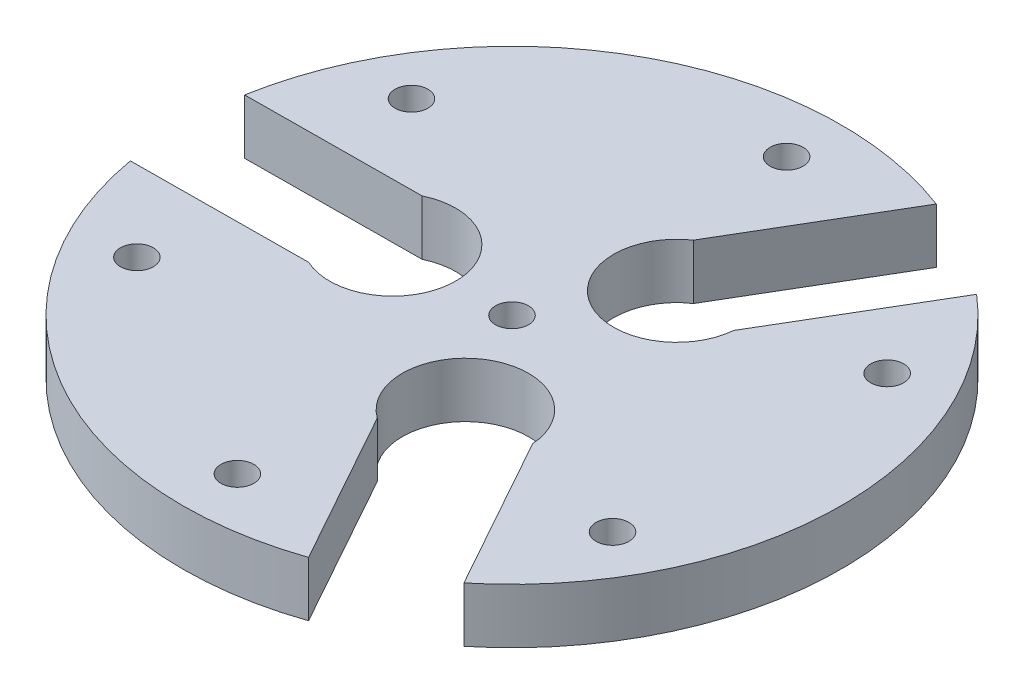
ISO-10303-21;
HEADER;
FILE_DESCRIPTION(('STEP AP214'),'2;1');
FILE_NAME('part.step','',(''),(''),'','','');
FILE_SCHEMA(('AUTOMOTIVE_DESIGN { 1 0 10303 214 1 1 1 1 }'));
ENDSEC;
DATA;
#1=APPLICATION_CONTEXT('core data for automotive mechanical design processes');
#2=APPLICATION_PROTOCOL_DEFINITION('international standard','automotive_design',2000,#1);
#3=PRODUCT_CONTEXT('',#1,'mechanical');
#4=PRODUCT('Part','Part','',(#3));
#5=PRODUCT_RELATED_PRODUCT_CATEGORY('part','',(#4));
#6=PRODUCT_DEFINITION_FORMATION('','',#4);
#7=PRODUCT_DEFINITION_CONTEXT('part definition',#1,'design');
#8=PRODUCT_DEFINITION('design','',#6,#7);
#9=PRODUCT_DEFINITION_SHAPE('','',#8);
#10=(LENGTH_UNIT() NAMED_UNIT(*) SI_UNIT(.MILLI.,.METRE.));
#11=(NAMED_UNIT(*) PLANE_ANGLE_UNIT() SI_UNIT($,.RADIAN.));
#12=(NAMED_UNIT(*) SI_UNIT($,.STERADIAN.) SOLID_ANGLE_UNIT());
#13=UNCERTAINTY_MEASURE_WITH_UNIT(LENGTH_MEASURE(1.E-05),#10,'distance_accuracy_value','');
#14=(GEOMETRIC_REPRESENTATION_CONTEXT(3) GLOBAL_UNCERTAINTY_ASSIGNED_CONTEXT((#13)) GLOBAL_UNIT_ASSIGNED_CONTEXT((#10,
#11,#12)) REPRESENTATION_CONTEXT('',''));
#15=CARTESIAN_POINT('',(0.,0.,0.));
#16=DIRECTION('',(0.,0.,1.));
#17=DIRECTION('',(1.,0.,0.));
#18=AXIS2_PLACEMENT_3D('',#15,#16,#17);
#19=CARTESIAN_POINT('',(0.,5.,0.));
#20=DIRECTION('',(0.,-1.,0.));
#21=DIRECTION('',(0.,0.,-1.));
#22=AXIS2_PLACEMENT_3D('',#19,#20,#21);
#23=CYLINDRICAL_SURFACE('',#22,30.);
#24=CARTESIAN_POINT('',(0.,5.,0.));
#25=DIRECTION('',(0.,1.,0.));
#26=DIRECTION('',(0.,0.,1.));
#27=AXIS2_PLACEMENT_3D('',#24,#25,#26);
#28=CIRCLE('',#27,30.);
#29=CARTESIAN_POINT('',(-29.5464548136969,5.,5.19682671850488));
#30=VERTEX_POINT('',#29);
#31=CARTESIAN_POINT('',(9.82540013085804,5.,28.34539666804));
#32=VERTEX_POINT('',#31);
#33=EDGE_CURVE('E164',#30,#32,#28,.T.);
#34=ORIENTED_EDGE('',*,*,#33,.F.);
#35=DIRECTION('',(0.,-1.,0.));
#36=VECTOR('',#35,1.);
#37=CARTESIAN_POINT('',(-29.5464548136969,5.,5.19682671850488));
#38=LINE('',#37,#36);
#39=CARTESIAN_POINT('',(-29.5464548136969,0.,5.19682671850488));
#40=VERTEX_POINT('',#39);
#41=EDGE_CURVE('E267',#30,#40,#38,.T.);
#42=ORIENTED_EDGE('',*,*,#41,.T.);
#43=CARTESIAN_POINT('',(0.,0.,0.));
#44=DIRECTION('',(0.,1.,0.));
#45=DIRECTION('',(0.,0.,1.));
#46=AXIS2_PLACEMENT_3D('',#43,#44,#45);
#47=CIRCLE('',#46,30.);
#48=CARTESIAN_POINT('',(9.82540013085803,0.,28.34539666804));
#49=VERTEX_POINT('',#48);
#50=EDGE_CURVE('E168',#40,#49,#47,.T.);
#51=ORIENTED_EDGE('',*,*,#50,.T.);
#52=DIRECTION('',(0.,-1.,0.));
#53=VECTOR('',#52,1.);
#54=CARTESIAN_POINT('',(9.82540013085803,5.,28.34539666804));
#55=LINE('',#54,#53);
#56=EDGE_CURVE('E268',#49,#32,#55,.F.);
#57=ORIENTED_EDGE('',*,*,#56,.T.);
#58=EDGE_LOOP('',(#34,#42,#51,#57));
#59=FACE_BOUND('',#58,.T.);
#60=ADVANCED_FACE('F36',(#59),#23,.T.);
#61=CARTESIAN_POINT('',(10.5363716890121,0.,-28.088874516986));
#62=VERTEX_POINT('',#61);
#63=CARTESIAN_POINT('',(-29.5452875017292,0.,-5.203459084125));
#64=VERTEX_POINT('',#63);
#65=EDGE_CURVE('E171',#62,#64,#47,.T.);
#66=ORIENTED_EDGE('',*,*,#65,.T.);
#67=DIRECTION('',(0.,-1.,0.));
#68=VECTOR('',#67,1.);
#69=CARTESIAN_POINT('',(-29.5452875017292,5.,-5.203459084125));
#70=LINE('',#69,#68);
#71=CARTESIAN_POINT('',(-29.5452875017292,5.,-5.203459084125));
#72=VERTEX_POINT('',#71);
#73=EDGE_CURVE('E282',#64,#72,#70,.F.);
#74=ORIENTED_EDGE('',*,*,#73,.T.);
#75=CARTESIAN_POINT('',(10.5363716890121,5.,-28.088874516986));
#76=VERTEX_POINT('',#75);
#77=EDGE_CURVE('E145',#76,#72,#28,.T.);
#78=ORIENTED_EDGE('',*,*,#77,.F.);
#79=DIRECTION('',(0.,-1.,0.));
#80=VECTOR('',#79,1.);
#81=CARTESIAN_POINT('',(10.5363716890121,5.,-28.088874516986));
#82=LINE('',#81,#80);
#83=EDGE_CURVE('E220',#76,#62,#82,.T.);
#84=ORIENTED_EDGE('',*,*,#83,.T.);
#85=EDGE_LOOP('',(#66,#74,#78,#84));
#86=FACE_BOUND('',#85,.T.);
#87=ADVANCED_FACE('F255',(#86),#23,.T.);
#88=CARTESIAN_POINT('',(18.9126667814305,0.,23.2875725487775));
#89=VERTEX_POINT('',#88);
#90=CARTESIAN_POINT('',(19.4933352486007,0.,-22.8037251537038));
#91=VERTEX_POINT('',#90);
#92=EDGE_CURVE('E167',#89,#91,#47,.T.);
#93=ORIENTED_EDGE('',*,*,#92,.T.);
#94=DIRECTION('',(0.,-1.,0.));
#95=VECTOR('',#94,1.);
#96=CARTESIAN_POINT('',(19.4933352486007,5.,-22.8037251537038));
#97=LINE('',#96,#95);
#98=CARTESIAN_POINT('',(19.4933352486007,5.,-22.8037251537038));
#99=VERTEX_POINT('',#98);
#100=EDGE_CURVE('E221',#91,#99,#97,.F.);
#101=ORIENTED_EDGE('',*,*,#100,.T.);
#102=CARTESIAN_POINT('',(18.9126667814305,5.,23.2875725487775));
#103=VERTEX_POINT('',#102);
#104=EDGE_CURVE('E135',#103,#99,#28,.T.);
#105=ORIENTED_EDGE('',*,*,#104,.F.);
#106=DIRECTION('',(0.,-1.,0.));
#107=VECTOR('',#106,1.);
#108=CARTESIAN_POINT('',(18.9126667814305,5.,23.2875725487775));
#109=LINE('',#108,#107);
#110=EDGE_CURVE('E295',#103,#89,#109,.T.);
#111=ORIENTED_EDGE('',*,*,#110,.T.);
#112=EDGE_LOOP('',(#93,#101,#105,#111));
#113=FACE_BOUND('',#112,.T.);
#114=ADVANCED_FACE('F38',(#113),#23,.T.);
#115=CARTESIAN_POINT('',(0.,5.,0.));
#116=DIRECTION('',(0.,1.,0.));
#117=DIRECTION('',(0.,0.,1.));
#118=AXIS2_PLACEMENT_3D('',#115,#116,#117);
#119=PLANE('',#118);
#120=DIRECTION('',(0.999973339309519,0.,-0.00730210039432319));
#121=VECTOR('',#120,1.);
#122=CARTESIAN_POINT('',(-10.9702272881856,5.,5.06117762366727));
#123=LINE('',#122,#121);
#124=CARTESIAN_POINT('',(-13.4242400991269,5.,5.07909754933931));
#125=VERTEX_POINT('',#124);
#126=EDGE_CURVE('E146',#30,#125,#123,.T.);
#127=ORIENTED_EDGE('',*,*,#126,.F.);
#128=ORIENTED_EDGE('',*,*,#33,.T.);
#129=DIRECTION('',(0.486329242236781,0.,0.87377563947812));
#130=VECTOR('',#129,1.);
#131=CARTESIAN_POINT('',(0.781671877206522,5.,12.0967553119167));
#132=LINE('',#131,#130);
#133=CARTESIAN_POINT('',(1.9751618872587,5.,14.2410690939704));
#134=VERTEX_POINT('',#133);
#135=EDGE_CURVE('E271',#134,#32,#132,.T.);
#136=ORIENTED_EDGE('',*,*,#135,.F.);
#137=CARTESIAN_POINT('',(5.32530520249275,5.,9.56784325228541));
#138=DIRECTION('',(0.,1.,0.));
#139=DIRECTION('',(0.,0.,1.));
#140=AXIS2_PLACEMENT_3D('',#137,#138,#139);
#141=CIRCLE('',#140,5.75);
#142=CARTESIAN_POINT('',(11.0624285378312,5.,9.18324497470791));
#143=VERTEX_POINT('',#142);
#144=EDGE_CURVE('E150',#143,#134,#141,.T.);
#145=ORIENTED_EDGE('',*,*,#144,.F.);
#146=DIRECTION('',(-0.486329242236781,0.,-0.87377563947812));
#147=VECTOR('',#146,1.);
#148=CARTESIAN_POINT('',(9.86893852777898,5.,7.03893119265415));
#149=LINE('',#148,#147);
#150=EDGE_CURVE('E279',#103,#143,#149,.T.);
#151=ORIENTED_EDGE('',*,*,#150,.F.);
#152=ORIENTED_EDGE('',*,*,#104,.T.);
#153=DIRECTION('',(0.508187438777136,0.,-0.861246496114286));
#154=VECTOR('',#153,1.);
#155=CARTESIAN_POINT('',(10.0431342344039,5.,-6.78807445081033));
#156=LINE('',#155,#154);
#157=CARTESIAN_POINT('',(11.2902659689156,5.,-8.90164073478959));
#158=VERTEX_POINT('',#157);
#159=EDGE_CURVE('E273',#158,#99,#156,.T.);
#160=ORIENTED_EDGE('',*,*,#159,.F.);
#161=CARTESIAN_POINT('',(5.56465245460964,5.,-9.43064913245143));
#162=DIRECTION('',(0.,1.,0.));
#163=DIRECTION('',(0.,0.,1.));
#164=AXIS2_PLACEMENT_3D('',#161,#162,#163);
#165=CIRCLE('',#164,5.75000000000001);
#166=CARTESIAN_POINT('',(2.33330240932705,5.,-14.1867900980718));
#167=VERTEX_POINT('',#166);
#168=EDGE_CURVE('E154',#167,#158,#165,.T.);
#169=ORIENTED_EDGE('',*,*,#168,.F.);
#170=DIRECTION('',(-0.508187438777136,0.,0.861246496114286));
#171=VECTOR('',#170,1.);
#172=CARTESIAN_POINT('',(1.08617067481535,5.,-12.0732238140925));
#173=LINE('',#172,#171);
#174=EDGE_CURVE('E59',#76,#167,#173,.T.);
#175=ORIENTED_EDGE('',*,*,#174,.F.);
#176=ORIENTED_EDGE('',*,*,#77,.T.);
#177=DIRECTION('',(-0.999973339309519,0.,0.00730210039432328));
#178=VECTOR('',#177,1.);
#179=CARTESIAN_POINT('',(-11.0461691322866,5.,-5.33854510515174));
#180=LINE('',#179,#178);
#181=CARTESIAN_POINT('',(-13.5001819432279,5.,-5.3206251794797));
#182=VERTEX_POINT('',#181);
#183=EDGE_CURVE('E126',#182,#72,#180,.T.);
#184=ORIENTED_EDGE('',*,*,#183,.F.);
#185=CARTESIAN_POINT('',(-11.0081982102361,5.,-0.13868374074223));
#186=DIRECTION('',(0.,1.,0.));
#187=DIRECTION('',(0.,0.,1.));
#188=AXIS2_PLACEMENT_3D('',#185,#186,#187);
#189=CIRCLE('',#188,5.75);
#190=EDGE_CURVE('E143',#125,#182,#189,.T.);
#191=ORIENTED_EDGE('',*,*,#190,.F.);
#192=EDGE_LOOP('',(#127,#128,#136,#145,#151,#152,#160,#169,#175,#176,#184,#191));
#193=FACE_BOUND('',#192,.T.);
#194=CARTESIAN_POINT('',(21.6506350946108,5.,-12.5000000000003));
#195=DIRECTION('',(0.,1.,0.));
#196=DIRECTION('',(-0.866025403784433,0.,0.50000000000001));
#197=AXIS2_PLACEMENT_3D('',#194,#195,#196);
#198=CIRCLE('',#197,1.5);
#199=CARTESIAN_POINT('',(20.3515969889342,5.,-11.7500000000002));
#200=VERTEX_POINT('',#199);
#201=EDGE_CURVE('E223',#200,#200,#198,.T.);
#202=ORIENTED_EDGE('',*,*,#201,.F.);
#203=EDGE_LOOP('',(#202));
#204=FACE_BOUND('',#203,.T.);
#205=CARTESIAN_POINT('',(21.6506350946111,5.,12.4999999999998));
#206=DIRECTION('',(0.,1.,0.));
#207=DIRECTION('',(-0.866025403784443,0.,-0.499999999999992));
#208=AXIS2_PLACEMENT_3D('',#205,#206,#207);
#209=CIRCLE('',#208,1.5);
#210=CARTESIAN_POINT('',(20.3515969889344,5.,11.7499999999998));
#211=VERTEX_POINT('',#210);
#212=EDGE_CURVE('E235',#211,#211,#209,.T.);
#213=ORIENTED_EDGE('',*,*,#212,.F.);
#214=EDGE_LOOP('',(#213));
#215=FACE_BOUND('',#214,.T.);
#216=CARTESIAN_POINT('',(0.,5.,25.));
#217=DIRECTION('',(0.,1.,0.));
#218=DIRECTION('',(0.,0.,-1.));
#219=AXIS2_PLACEMENT_3D('',#216,#217,#218);
#220=CIRCLE('',#219,1.5);
#221=CARTESIAN_POINT('',(0.,5.,23.5));
#222=VERTEX_POINT('',#221);
#223=EDGE_CURVE('E232',#222,#222,#220,.T.);
#224=ORIENTED_EDGE('',*,*,#223,.F.);
#225=EDGE_LOOP('',(#224));
#226=FACE_BOUND('',#225,.T.);
#227=CARTESIAN_POINT('',(-21.6506350946109,5.,12.5000000000001));
#228=DIRECTION('',(0.,1.,0.));
#229=DIRECTION('',(0.866025403784436,0.,-0.500000000000004));
#230=AXIS2_PLACEMENT_3D('',#227,#228,#229);
#231=CIRCLE('',#230,1.5);
#232=CARTESIAN_POINT('',(-20.3515969889343,5.,11.7500000000001));
#233=VERTEX_POINT('',#232);
#234=EDGE_CURVE('E229',#233,#233,#231,.T.);
#235=ORIENTED_EDGE('',*,*,#234,.F.);
#236=EDGE_LOOP('',(#235));
#237=FACE_BOUND('',#236,.T.);
#238=CARTESIAN_POINT('',(-21.650635094611,5.,-12.5));
#239=DIRECTION('',(0.,1.,0.));
#240=DIRECTION('',(0.86602540378444,0.,0.499999999999998));
#241=AXIS2_PLACEMENT_3D('',#238,#239,#240);
#242=CIRCLE('',#241,1.5);
#243=CARTESIAN_POINT('',(-20.3515969889343,5.,-11.75));
#244=VERTEX_POINT('',#243);
#245=EDGE_CURVE('E187',#244,#244,#242,.T.);
#246=ORIENTED_EDGE('',*,*,#245,.F.);
#247=EDGE_LOOP('',(#246));
#248=FACE_BOUND('',#247,.T.);
#249=CARTESIAN_POINT('',(0.,5.,-25.));
#250=DIRECTION('',(0.,1.,0.));
#251=DIRECTION('',(0.,0.,1.));
#252=AXIS2_PLACEMENT_3D('',#249,#250,#251);
#253=CIRCLE('',#252,1.5);
#254=CARTESIAN_POINT('',(0.,5.,-23.5));
#255=VERTEX_POINT('',#254);
#256=EDGE_CURVE('E182',#255,#255,#253,.T.);
#257=ORIENTED_EDGE('',*,*,#256,.F.);
#258=EDGE_LOOP('',(#257));
#259=FACE_BOUND('',#258,.T.);
#260=CARTESIAN_POINT('',(0.,5.,0.));
#261=DIRECTION('',(0.,1.,0.));
#262=DIRECTION('',(0.,0.,1.));
#263=AXIS2_PLACEMENT_3D('',#260,#261,#262);
#264=CIRCLE('',#263,1.5);
#265=CARTESIAN_POINT('',(0.,5.,1.5));
#266=VERTEX_POINT('',#265);
#267=EDGE_CURVE('E157',#266,#266,#264,.T.);
#268=ORIENTED_EDGE('',*,*,#267,.F.);
#269=EDGE_LOOP('',(#268));
#270=FACE_BOUND('',#269,.T.);
#271=ADVANCED_FACE('F141',(#193,#204,#215,#226,#237,#248,#259,#270),#119,.T.);
#272=CARTESIAN_POINT('',(0.,0.,0.));
#273=DIRECTION('',(0.,1.,0.));
#274=DIRECTION('',(0.,0.,1.));
#275=AXIS2_PLACEMENT_3D('',#272,#273,#274);
#276=PLANE('',#275);
#277=CARTESIAN_POINT('',(21.6506350946108,0.,-12.5000000000003));
#278=DIRECTION('',(0.,1.,0.));
#279=DIRECTION('',(0.,0.,1.));
#280=AXIS2_PLACEMENT_3D('',#277,#278,#279);
#281=CIRCLE('',#280,1.5);
#282=CARTESIAN_POINT('',(21.6506350946108,0.,-11.0000000000003));
#283=VERTEX_POINT('',#282);
#284=EDGE_CURVE('E196',#283,#283,#281,.T.);
#285=ORIENTED_EDGE('',*,*,#284,.T.);
#286=EDGE_LOOP('',(#285));
#287=FACE_BOUND('',#286,.T.);
#288=CARTESIAN_POINT('',(21.6506350946111,0.,12.4999999999998));
#289=DIRECTION('',(0.,1.,0.));
#290=DIRECTION('',(0.,0.,1.));
#291=AXIS2_PLACEMENT_3D('',#288,#289,#290);
#292=CIRCLE('',#291,1.5);
#293=CARTESIAN_POINT('',(21.6506350946111,0.,13.9999999999998));
#294=VERTEX_POINT('',#293);
#295=EDGE_CURVE('E193',#294,#294,#292,.T.);
#296=ORIENTED_EDGE('',*,*,#295,.T.);
#297=EDGE_LOOP('',(#296));
#298=FACE_BOUND('',#297,.T.);
#299=CARTESIAN_POINT('',(0.,0.,25.));
#300=DIRECTION('',(0.,1.,0.));
#301=DIRECTION('',(0.,0.,1.));
#302=AXIS2_PLACEMENT_3D('',#299,#300,#301);
#303=CIRCLE('',#302,1.5);
#304=CARTESIAN_POINT('',(0.,0.,26.5));
#305=VERTEX_POINT('',#304);
#306=EDGE_CURVE('E190',#305,#305,#303,.T.);
#307=ORIENTED_EDGE('',*,*,#306,.T.);
#308=EDGE_LOOP('',(#307));
#309=FACE_BOUND('',#308,.T.);
#310=CARTESIAN_POINT('',(-21.6506350946109,0.,12.5000000000001));
#311=DIRECTION('',(0.,1.,0.));
#312=DIRECTION('',(0.,0.,1.));
#313=AXIS2_PLACEMENT_3D('',#310,#311,#312);
#314=CIRCLE('',#313,1.5);
#315=CARTESIAN_POINT('',(-21.6506350946109,0.,14.0000000000001));
#316=VERTEX_POINT('',#315);
#317=EDGE_CURVE('E186',#316,#316,#314,.T.);
#318=ORIENTED_EDGE('',*,*,#317,.T.);
#319=EDGE_LOOP('',(#318));
#320=FACE_BOUND('',#319,.T.);
#321=CARTESIAN_POINT('',(-21.650635094611,0.,-12.5));
#322=DIRECTION('',(0.,1.,0.));
#323=DIRECTION('',(0.,0.,1.));
#324=AXIS2_PLACEMENT_3D('',#321,#322,#323);
#325=CIRCLE('',#324,1.5);
#326=CARTESIAN_POINT('',(-21.650635094611,0.,-10.9999999999999));
#327=VERTEX_POINT('',#326);
#328=EDGE_CURVE('E183',#327,#327,#325,.T.);
#329=ORIENTED_EDGE('',*,*,#328,.T.);
#330=EDGE_LOOP('',(#329));
#331=FACE_BOUND('',#330,.T.);
#332=CARTESIAN_POINT('',(0.,0.,-25.));
#333=DIRECTION('',(0.,1.,0.));
#334=DIRECTION('',(0.,0.,1.));
#335=AXIS2_PLACEMENT_3D('',#332,#333,#334);
#336=CIRCLE('',#335,1.5);
#337=CARTESIAN_POINT('',(0.,0.,-23.5));
#338=VERTEX_POINT('',#337);
#339=EDGE_CURVE('E179',#338,#338,#336,.T.);
#340=ORIENTED_EDGE('',*,*,#339,.T.);
#341=EDGE_LOOP('',(#340));
#342=FACE_BOUND('',#341,.T.);
#343=CARTESIAN_POINT('',(0.,0.,0.));
#344=DIRECTION('',(0.,1.,0.));
#345=DIRECTION('',(0.,0.,1.));
#346=AXIS2_PLACEMENT_3D('',#343,#344,#345);
#347=CIRCLE('',#346,1.5);
#348=CARTESIAN_POINT('',(0.,0.,1.5));
#349=VERTEX_POINT('',#348);
#350=EDGE_CURVE('E151',#349,#349,#347,.T.);
#351=ORIENTED_EDGE('',*,*,#350,.T.);
#352=EDGE_LOOP('',(#351));
#353=FACE_BOUND('',#352,.T.);
#354=ORIENTED_EDGE('',*,*,#50,.F.);
#355=DIRECTION('',(0.99997333930952,0.,-0.0073021003943232));
#356=VECTOR('',#355,1.);
#357=CARTESIAN_POINT('',(0.0363713019454174,0.,4.98080419295096));
#358=LINE('',#357,#356);
#359=CARTESIAN_POINT('',(-13.4242400991269,0.,5.07909754933931));
#360=VERTEX_POINT('',#359);
#361=EDGE_CURVE('E284',#40,#360,#358,.T.);
#362=ORIENTED_EDGE('',*,*,#361,.T.);
#363=CARTESIAN_POINT('',(-11.0081982102361,0.,-0.13868374074223));
#364=DIRECTION('',(0.,1.,0.));
#365=DIRECTION('',(0.,0.,1.));
#366=AXIS2_PLACEMENT_3D('',#363,#364,#365);
#367=CIRCLE('',#366,5.75);
#368=CARTESIAN_POINT('',(-13.5001819432279,0.,-5.3206251794797));
#369=VERTEX_POINT('',#368);
#370=EDGE_CURVE('E172',#360,#369,#367,.T.);
#371=ORIENTED_EDGE('',*,*,#370,.T.);
#372=DIRECTION('',(-0.99997333930952,0.,0.00730210039432329));
#373=VECTOR('',#372,1.);
#374=CARTESIAN_POINT('',(-0.0395705421555444,0.,-5.41891853586805));
#375=LINE('',#374,#373);
#376=EDGE_CURVE('E129',#369,#64,#375,.T.);
#377=ORIENTED_EDGE('',*,*,#376,.T.);
#378=ORIENTED_EDGE('',*,*,#65,.F.);
#379=DIRECTION('',(-0.508187438777136,0.,0.861246496114286));
#380=VECTOR('',#379,1.);
#381=CARTESIAN_POINT('',(-4.47848177979429,0.,-2.64257468164111));
#382=LINE('',#381,#380);
#383=CARTESIAN_POINT('',(2.33330240932705,0.,-14.1867900980718));
#384=VERTEX_POINT('',#383);
#385=EDGE_CURVE('E217',#62,#384,#382,.T.);
#386=ORIENTED_EDGE('',*,*,#385,.T.);
#387=CARTESIAN_POINT('',(5.56465245460964,0.,-9.43064913245143));
#388=DIRECTION('',(0.,1.,0.));
#389=DIRECTION('',(0.,0.,1.));
#390=AXIS2_PLACEMENT_3D('',#387,#388,#389);
#391=CIRCLE('',#390,5.75000000000001);
#392=CARTESIAN_POINT('',(11.2902659689156,0.,-8.90164073478959));
#393=VERTEX_POINT('',#392);
#394=EDGE_CURVE('E163',#384,#393,#391,.T.);
#395=ORIENTED_EDGE('',*,*,#394,.T.);
#396=DIRECTION('',(0.508187438777136,0.,-0.861246496114286));
#397=VECTOR('',#396,1.);
#398=CARTESIAN_POINT('',(4.47848177979429,0.,2.64257468164111));
#399=LINE('',#398,#397);
#400=EDGE_CURVE('E51',#393,#91,#399,.T.);
#401=ORIENTED_EDGE('',*,*,#400,.T.);
#402=ORIENTED_EDGE('',*,*,#92,.F.);
#403=DIRECTION('',(-0.486329242236781,0.,-0.873775639478121));
#404=VECTOR('',#403,1.);
#405=CARTESIAN_POINT('',(4.54363332528623,0.,-2.52891205963126));
#406=LINE('',#405,#404);
#407=CARTESIAN_POINT('',(11.0624285378312,0.,9.18324497470791));
#408=VERTEX_POINT('',#407);
#409=EDGE_CURVE('E292',#89,#408,#406,.T.);
#410=ORIENTED_EDGE('',*,*,#409,.T.);
#411=CARTESIAN_POINT('',(5.32530520249275,0.,9.56784325228541));
#412=DIRECTION('',(0.,1.,0.));
#413=DIRECTION('',(0.,0.,1.));
#414=AXIS2_PLACEMENT_3D('',#411,#412,#413);
#415=CIRCLE('',#414,5.75);
#416=CARTESIAN_POINT('',(1.9751618872587,0.,14.2410690939704));
#417=VERTEX_POINT('',#416);
#418=EDGE_CURVE('E175',#408,#417,#415,.T.);
#419=ORIENTED_EDGE('',*,*,#418,.T.);
#420=DIRECTION('',(0.486329242236781,0.,0.873775639478121));
#421=VECTOR('',#420,1.);
#422=CARTESIAN_POINT('',(-4.54363332528623,0.,2.52891205963126));
#423=LINE('',#422,#421);
#424=EDGE_CURVE('E288',#417,#49,#423,.T.);
#425=ORIENTED_EDGE('',*,*,#424,.T.);
#426=EDGE_LOOP('',(#354,#362,#371,#377,#378,#386,#395,#401,#402,#410,#419,#425));
#427=FACE_BOUND('',#426,.T.);
#428=ADVANCED_FACE('F213',(#287,#298,#309,#320,#331,#342,#353,#427),#276,.F.);
#429=CARTESIAN_POINT('',(5.56465245460964,-45.,-9.43064913245143));
#430=DIRECTION('',(0.,1.,0.));
#431=DIRECTION('',(0.,0.,1.));
#432=AXIS2_PLACEMENT_3D('',#429,#430,#431);
#433=CYLINDRICAL_SURFACE('',#432,5.75000000000001);
#434=ORIENTED_EDGE('',*,*,#394,.F.);
#435=DIRECTION('',(0.,1.,0.));
#436=VECTOR('',#435,1.);
#437=CARTESIAN_POINT('',(2.33330240932705,-45.,-14.1867900980718));
#438=LINE('',#437,#436);
#439=EDGE_CURVE('E11',#384,#167,#438,.T.);
#440=ORIENTED_EDGE('',*,*,#439,.T.);
#441=ORIENTED_EDGE('',*,*,#168,.T.);
#442=DIRECTION('',(0.,1.,0.));
#443=VECTOR('',#442,1.);
#444=CARTESIAN_POINT('',(11.2902659689156,-45.,-8.90164073478959));
#445=LINE('',#444,#443);
#446=EDGE_CURVE('E44',#158,#393,#445,.F.);
#447=ORIENTED_EDGE('',*,*,#446,.T.);
#448=EDGE_LOOP('',(#434,#440,#441,#447));
#449=FACE_BOUND('',#448,.T.);
#450=ADVANCED_FACE('F207',(#449),#433,.F.);
#451=CARTESIAN_POINT('',(5.32530520249275,-45.,9.56784325228541));
#452=DIRECTION('',(0.,1.,0.));
#453=DIRECTION('',(0.,0.,1.));
#454=AXIS2_PLACEMENT_3D('',#451,#452,#453);
#455=CYLINDRICAL_SURFACE('',#454,5.75);
#456=ORIENTED_EDGE('',*,*,#418,.F.);
#457=DIRECTION('',(0.,1.,0.));
#458=VECTOR('',#457,1.);
#459=CARTESIAN_POINT('',(11.0624285378312,-45.,9.18324497470791));
#460=LINE('',#459,#458);
#461=EDGE_CURVE('E203',#408,#143,#460,.T.);
#462=ORIENTED_EDGE('',*,*,#461,.T.);
#463=ORIENTED_EDGE('',*,*,#144,.T.);
#464=DIRECTION('',(0.,1.,0.));
#465=VECTOR('',#464,1.);
#466=CARTESIAN_POINT('',(1.9751618872587,-45.,14.2410690939704));
#467=LINE('',#466,#465);
#468=EDGE_CURVE('E200',#134,#417,#467,.F.);
#469=ORIENTED_EDGE('',*,*,#468,.T.);
#470=EDGE_LOOP('',(#456,#462,#463,#469));
#471=FACE_BOUND('',#470,.T.);
#472=ADVANCED_FACE('F350',(#471),#455,.F.);
#473=CARTESIAN_POINT('',(-11.0081982102361,-45.,-0.13868374074223));
#474=DIRECTION('',(0.,1.,0.));
#475=DIRECTION('',(0.,0.,1.));
#476=AXIS2_PLACEMENT_3D('',#473,#474,#475);
#477=CYLINDRICAL_SURFACE('',#476,5.75);
#478=ORIENTED_EDGE('',*,*,#370,.F.);
#479=DIRECTION('',(0.,1.,0.));
#480=VECTOR('',#479,1.);
#481=CARTESIAN_POINT('',(-13.4242400991269,-45.,5.07909754933931));
#482=LINE('',#481,#480);
#483=EDGE_CURVE('E134',#360,#125,#482,.T.);
#484=ORIENTED_EDGE('',*,*,#483,.T.);
#485=ORIENTED_EDGE('',*,*,#190,.T.);
#486=DIRECTION('',(0.,1.,0.));
#487=VECTOR('',#486,1.);
#488=CARTESIAN_POINT('',(-13.5001819432279,-45.,-5.3206251794797));
#489=LINE('',#488,#487);
#490=EDGE_CURVE('E123',#182,#369,#489,.F.);
#491=ORIENTED_EDGE('',*,*,#490,.T.);
#492=EDGE_LOOP('',(#478,#484,#485,#491));
#493=FACE_BOUND('',#492,.T.);
#494=ADVANCED_FACE('F149',(#493),#477,.F.);
#495=CARTESIAN_POINT('',(0.,0.,0.));
#496=DIRECTION('',(0.,1.,0.));
#497=DIRECTION('',(0.,0.,1.));
#498=AXIS2_PLACEMENT_3D('',#495,#496,#497);
#499=CYLINDRICAL_SURFACE('',#498,1.5);
#500=ORIENTED_EDGE('',*,*,#350,.F.);
#501=EDGE_LOOP('',(#500));
#502=FACE_BOUND('',#501,.T.);
#503=ORIENTED_EDGE('',*,*,#267,.T.);
#504=EDGE_LOOP('',(#503));
#505=FACE_BOUND('',#504,.T.);
#506=ADVANCED_FACE('F246',(#502,#505),#499,.F.);
#507=CARTESIAN_POINT('',(0.,-5.,-25.));
#508=DIRECTION('',(0.,1.,0.));
#509=DIRECTION('',(0.,0.,1.));
#510=AXIS2_PLACEMENT_3D('',#507,#508,#509);
#511=CYLINDRICAL_SURFACE('',#510,1.5);
#512=ORIENTED_EDGE('',*,*,#256,.T.);
#513=EDGE_LOOP('',(#512));
#514=FACE_BOUND('',#513,.T.);
#515=ORIENTED_EDGE('',*,*,#339,.F.);
#516=EDGE_LOOP('',(#515));
#517=FACE_BOUND('',#516,.T.);
#518=ADVANCED_FACE('F342',(#514,#517),#511,.F.);
#519=CARTESIAN_POINT('',(-21.650635094611,-5.,-12.5));
#520=DIRECTION('',(0.,1.,0.));
#521=DIRECTION('',(0.,0.,1.));
#522=AXIS2_PLACEMENT_3D('',#519,#520,#521);
#523=CYLINDRICAL_SURFACE('',#522,1.5);
#524=ORIENTED_EDGE('',*,*,#245,.T.);
#525=EDGE_LOOP('',(#524));
#526=FACE_BOUND('',#525,.T.);
#527=ORIENTED_EDGE('',*,*,#328,.F.);
#528=EDGE_LOOP('',(#527));
#529=FACE_BOUND('',#528,.T.);
#530=ADVANCED_FACE('F328',(#526,#529),#523,.F.);
#531=CARTESIAN_POINT('',(-21.6506350946109,-5.,12.5000000000001));
#532=DIRECTION('',(0.,1.,0.));
#533=DIRECTION('',(0.,0.,1.));
#534=AXIS2_PLACEMENT_3D('',#531,#532,#533);
#535=CYLINDRICAL_SURFACE('',#534,1.5);
#536=ORIENTED_EDGE('',*,*,#234,.T.);
#537=EDGE_LOOP('',(#536));
#538=FACE_BOUND('',#537,.T.);
#539=ORIENTED_EDGE('',*,*,#317,.F.);
#540=EDGE_LOOP('',(#539));
#541=FACE_BOUND('',#540,.T.);
#542=ADVANCED_FACE('F324',(#538,#541),#535,.F.);
#543=CARTESIAN_POINT('',(0.,-5.,25.));
#544=DIRECTION('',(0.,1.,0.));
#545=DIRECTION('',(0.,0.,1.));
#546=AXIS2_PLACEMENT_3D('',#543,#544,#545);
#547=CYLINDRICAL_SURFACE('',#546,1.5);
#548=ORIENTED_EDGE('',*,*,#223,.T.);
#549=EDGE_LOOP('',(#548));
#550=FACE_BOUND('',#549,.T.);
#551=ORIENTED_EDGE('',*,*,#306,.F.);
#552=EDGE_LOOP('',(#551));
#553=FACE_BOUND('',#552,.T.);
#554=ADVANCED_FACE('F327',(#550,#553),#547,.F.);
#555=CARTESIAN_POINT('',(21.6506350946111,-5.,12.4999999999998));
#556=DIRECTION('',(0.,1.,0.));
#557=DIRECTION('',(0.,0.,1.));
#558=AXIS2_PLACEMENT_3D('',#555,#556,#557);
#559=CYLINDRICAL_SURFACE('',#558,1.5);
#560=ORIENTED_EDGE('',*,*,#212,.T.);
#561=EDGE_LOOP('',(#560));
#562=FACE_BOUND('',#561,.T.);
#563=ORIENTED_EDGE('',*,*,#295,.F.);
#564=EDGE_LOOP('',(#563));
#565=FACE_BOUND('',#564,.T.);
#566=ADVANCED_FACE('F332',(#562,#565),#559,.F.);
#567=CARTESIAN_POINT('',(21.6506350946108,-5.,-12.5000000000003));
#568=DIRECTION('',(0.,1.,0.));
#569=DIRECTION('',(0.,0.,1.));
#570=AXIS2_PLACEMENT_3D('',#567,#568,#569);
#571=CYLINDRICAL_SURFACE('',#570,1.5);
#572=ORIENTED_EDGE('',*,*,#201,.T.);
#573=EDGE_LOOP('',(#572));
#574=FACE_BOUND('',#573,.T.);
#575=ORIENTED_EDGE('',*,*,#284,.F.);
#576=EDGE_LOOP('',(#575));
#577=FACE_BOUND('',#576,.T.);
#578=ADVANCED_FACE('F319',(#574,#577),#571,.F.);
#579=CARTESIAN_POINT('',(-11.0461691322866,-5.,-5.33854510515174));
#580=DIRECTION('',(-0.00730210039432328,0.,-0.999973339309519));
#581=DIRECTION('',(-0.99997333930952,0.,0.00730210039432329));
#582=AXIS2_PLACEMENT_3D('',#579,#580,#581);
#583=PLANE('',#582);
#584=ORIENTED_EDGE('',*,*,#376,.F.);
#585=ORIENTED_EDGE('',*,*,#490,.F.);
#586=ORIENTED_EDGE('',*,*,#183,.T.);
#587=ORIENTED_EDGE('',*,*,#73,.F.);
#588=EDGE_LOOP('',(#584,#585,#586,#587));
#589=FACE_BOUND('',#588,.T.);
#590=ADVANCED_FACE('F125',(#589),#583,.F.);
#591=CARTESIAN_POINT('',(-10.9702272881856,-5.,5.06117762366727));
#592=DIRECTION('',(0.00730210039432319,0.,0.999973339309519));
#593=DIRECTION('',(0.99997333930952,0.,-0.0073021003943232));
#594=AXIS2_PLACEMENT_3D('',#591,#592,#593);
#595=PLANE('',#594);
#596=ORIENTED_EDGE('',*,*,#126,.T.);
#597=ORIENTED_EDGE('',*,*,#483,.F.);
#598=ORIENTED_EDGE('',*,*,#361,.F.);
#599=ORIENTED_EDGE('',*,*,#41,.F.);
#600=EDGE_LOOP('',(#596,#597,#598,#599));
#601=FACE_BOUND('',#600,.T.);
#602=ADVANCED_FACE('F315',(#601),#595,.F.);
#603=CARTESIAN_POINT('',(0.781671877206522,-5.,12.0967553119167));
#604=DIRECTION('',(-0.87377563947812,0.,0.486329242236781));
#605=DIRECTION('',(0.486329242236781,0.,0.873775639478121));
#606=AXIS2_PLACEMENT_3D('',#603,#604,#605);
#607=PLANE('',#606);
#608=ORIENTED_EDGE('',*,*,#424,.F.);
#609=ORIENTED_EDGE('',*,*,#468,.F.);
#610=ORIENTED_EDGE('',*,*,#135,.T.);
#611=ORIENTED_EDGE('',*,*,#56,.F.);
#612=EDGE_LOOP('',(#608,#609,#610,#611));
#613=FACE_BOUND('',#612,.T.);
#614=ADVANCED_FACE('F312',(#613),#607,.F.);
#615=CARTESIAN_POINT('',(9.86893852777898,-5.,7.03893119265415));
#616=DIRECTION('',(0.873775639478121,0.,-0.486329242236781));
#617=DIRECTION('',(-0.486329242236781,0.,-0.873775639478121));
#618=AXIS2_PLACEMENT_3D('',#615,#616,#617);
#619=PLANE('',#618);
#620=ORIENTED_EDGE('',*,*,#150,.T.);
#621=ORIENTED_EDGE('',*,*,#461,.F.);
#622=ORIENTED_EDGE('',*,*,#409,.F.);
#623=ORIENTED_EDGE('',*,*,#110,.F.);
#624=EDGE_LOOP('',(#620,#621,#622,#623));
#625=FACE_BOUND('',#624,.T.);
#626=ADVANCED_FACE('F305',(#625),#619,.F.);
#627=CARTESIAN_POINT('',(10.0431342344039,-5.,-6.78807445081033));
#628=DIRECTION('',(0.861246496114286,0.,0.508187438777136));
#629=DIRECTION('',(0.508187438777136,0.,-0.861246496114286));
#630=AXIS2_PLACEMENT_3D('',#627,#628,#629);
#631=PLANE('',#630);
#632=ORIENTED_EDGE('',*,*,#400,.F.);
#633=ORIENTED_EDGE('',*,*,#446,.F.);
#634=ORIENTED_EDGE('',*,*,#159,.T.);
#635=ORIENTED_EDGE('',*,*,#100,.F.);
#636=EDGE_LOOP('',(#632,#633,#634,#635));
#637=FACE_BOUND('',#636,.T.);
#638=ADVANCED_FACE('F303',(#637),#631,.F.);
#639=CARTESIAN_POINT('',(1.08617067481535,-5.,-12.0732238140925));
#640=DIRECTION('',(-0.861246496114286,0.,-0.508187438777136));
#641=DIRECTION('',(-0.508187438777136,0.,0.861246496114286));
#642=AXIS2_PLACEMENT_3D('',#639,#640,#641);
#643=PLANE('',#642);
#644=ORIENTED_EDGE('',*,*,#174,.T.);
#645=ORIENTED_EDGE('',*,*,#439,.F.);
#646=ORIENTED_EDGE('',*,*,#385,.F.);
#647=ORIENTED_EDGE('',*,*,#83,.F.);
#648=EDGE_LOOP('',(#644,#645,#646,#647));
#649=FACE_BOUND('',#648,.T.);
#650=ADVANCED_FACE('F302',(#649),#643,.F.);
#651=CLOSED_SHELL('',(#60,#87,#114,#271,#428,#450,#472,#494,#506,#518,#530,#542,#554,#566,#578,
#590,#602,#614,#626,#638,#650));
#652=MANIFOLD_SOLID_BREP('B2',#651);
#653=ADVANCED_BREP_SHAPE_REPRESENTATION('',(#18,#652),#14);
#654=SHAPE_DEFINITION_REPRESENTATION(#9,#653);
ENDSEC;
END-ISO-10303-21;
